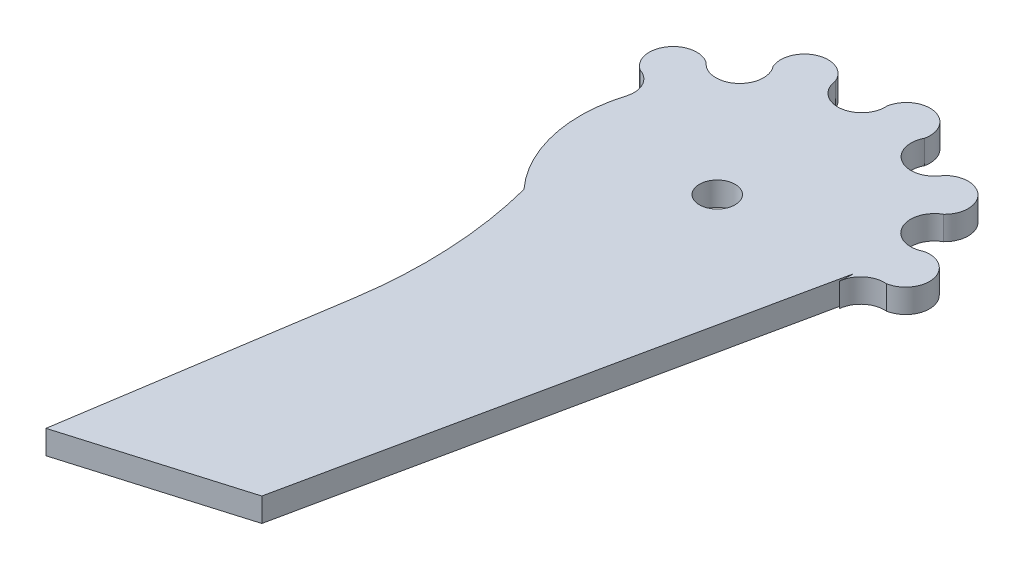
ISO-10303-21;
HEADER;
FILE_DESCRIPTION(('STEP AP214'),'2;1');
FILE_NAME('part.step','',(''),(''),'','','');
FILE_SCHEMA(('AUTOMOTIVE_DESIGN { 1 0 10303 214 1 1 1 1 }'));
ENDSEC;
DATA;
#1=APPLICATION_CONTEXT('core data for automotive mechanical design processes');
#2=APPLICATION_PROTOCOL_DEFINITION('international standard','automotive_design',2000,#1);
#3=PRODUCT_CONTEXT('',#1,'mechanical');
#4=PRODUCT('Part','Part','',(#3));
#5=PRODUCT_RELATED_PRODUCT_CATEGORY('part','',(#4));
#6=PRODUCT_DEFINITION_FORMATION('','',#4);
#7=PRODUCT_DEFINITION_CONTEXT('part definition',#1,'design');
#8=PRODUCT_DEFINITION('design','',#6,#7);
#9=PRODUCT_DEFINITION_SHAPE('','',#8);
#10=(LENGTH_UNIT() NAMED_UNIT(*) SI_UNIT(.MILLI.,.METRE.));
#11=(NAMED_UNIT(*) PLANE_ANGLE_UNIT() SI_UNIT($,.RADIAN.));
#12=(NAMED_UNIT(*) SI_UNIT($,.STERADIAN.) SOLID_ANGLE_UNIT());
#13=UNCERTAINTY_MEASURE_WITH_UNIT(LENGTH_MEASURE(1.E-05),#10,'distance_accuracy_value','');
#14=(GEOMETRIC_REPRESENTATION_CONTEXT(3) GLOBAL_UNCERTAINTY_ASSIGNED_CONTEXT((#13)) GLOBAL_UNIT_ASSIGNED_CONTEXT((#10,
#11,#12)) REPRESENTATION_CONTEXT('',''));
#15=CARTESIAN_POINT('',(0.,0.,0.));
#16=DIRECTION('',(0.,0.,1.));
#17=DIRECTION('',(1.,0.,0.));
#18=AXIS2_PLACEMENT_3D('',#15,#16,#17);
#19=CARTESIAN_POINT('',(11.0072870376266,1.,2.32882652939261));
#20=DIRECTION('',(0.978343188546959,0.,0.20698938480939));
#21=DIRECTION('',(0.20698938480939,0.,-0.978343188546959));
#22=AXIS2_PLACEMENT_3D('',#19,#20,#21);
#23=PLANE('',#22);
#24=DIRECTION('',(-0.20698938480939,0.,0.978343188546959));
#25=VECTOR('',#24,1.);
#26=CARTESIAN_POINT('',(11.0072870376266,-1.,2.32882652939261));
#27=LINE('',#26,#25);
#28=CARTESIAN_POINT('',(11.5,-1.,0.));
#29=VERTEX_POINT('',#28);
#30=CARTESIAN_POINT('',(2.8068078260398,-1.,41.0887029687808));
#31=VERTEX_POINT('',#30);
#32=EDGE_CURVE('E231',#29,#31,#27,.T.);
#33=ORIENTED_EDGE('',*,*,#32,.F.);
#34=DIRECTION('',(0.,-1.,0.));
#35=VECTOR('',#34,1.);
#36=CARTESIAN_POINT('',(11.5,1.,0.));
#37=LINE('',#36,#35);
#38=CARTESIAN_POINT('',(11.5,1.,0.));
#39=VERTEX_POINT('',#38);
#40=EDGE_CURVE('E11',#39,#29,#37,.T.);
#41=ORIENTED_EDGE('',*,*,#40,.F.);
#42=DIRECTION('',(-0.20698938480939,0.,0.978343188546959));
#43=VECTOR('',#42,1.);
#44=CARTESIAN_POINT('',(11.0072870376266,1.,2.32882652939261));
#45=LINE('',#44,#43);
#46=CARTESIAN_POINT('',(2.8068078260398,1.,41.0887029687808));
#47=VERTEX_POINT('',#46);
#48=EDGE_CURVE('E194',#39,#47,#45,.T.);
#49=ORIENTED_EDGE('',*,*,#48,.T.);
#50=DIRECTION('',(0.,-1.,0.));
#51=VECTOR('',#50,1.);
#52=CARTESIAN_POINT('',(2.8068078260398,1.,41.0887029687808));
#53=LINE('',#52,#51);
#54=EDGE_CURVE('E187',#47,#31,#53,.T.);
#55=ORIENTED_EDGE('',*,*,#54,.T.);
#56=EDGE_LOOP('',(#33,#41,#49,#55));
#57=FACE_BOUND('',#56,.T.);
#58=ADVANCED_FACE('F35',(#57),#23,.T.);
#59=CARTESIAN_POINT('',(0.,1.,0.));
#60=DIRECTION('',(0.,-1.,0.));
#61=DIRECTION('',(0.,0.,-1.));
#62=AXIS2_PLACEMENT_3D('',#59,#60,#61);
#63=CYLINDRICAL_SURFACE('',#62,11.5);
#64=CARTESIAN_POINT('',(0.,-1.,0.));
#65=DIRECTION('',(0.,1.,0.));
#66=DIRECTION('',(0.,0.,1.));
#67=AXIS2_PLACEMENT_3D('',#64,#65,#66);
#68=CIRCLE('',#67,11.5);
#69=CARTESIAN_POINT('',(11.4406165211658,-1.,1.16717334429321));
#70=VERTEX_POINT('',#69);
#71=EDGE_CURVE('E233',#70,#29,#68,.T.);
#72=ORIENTED_EDGE('',*,*,#71,.F.);
#73=DIRECTION('',(0.,-1.,0.));
#74=VECTOR('',#73,1.);
#75=CARTESIAN_POINT('',(11.4406165211658,1.,1.16717334429321));
#76=LINE('',#75,#74);
#77=CARTESIAN_POINT('',(11.4406165211658,1.,1.16717334429321));
#78=VERTEX_POINT('',#77);
#79=EDGE_CURVE('E43',#78,#70,#76,.T.);
#80=ORIENTED_EDGE('',*,*,#79,.F.);
#81=CARTESIAN_POINT('',(0.,1.,0.));
#82=DIRECTION('',(0.,1.,0.));
#83=DIRECTION('',(0.,0.,1.));
#84=AXIS2_PLACEMENT_3D('',#81,#82,#83);
#85=CIRCLE('',#84,11.5);
#86=EDGE_CURVE('E196',#78,#39,#85,.T.);
#87=ORIENTED_EDGE('',*,*,#86,.T.);
#88=ORIENTED_EDGE('',*,*,#40,.T.);
#89=EDGE_LOOP('',(#72,#80,#87,#88));
#90=FACE_BOUND('',#89,.T.);
#91=ADVANCED_FACE('F297',(#90),#63,.F.);
#92=CARTESIAN_POINT('',(13.4302889596294,1.,1.37016001286595));
#93=DIRECTION('',(0.,-1.,0.));
#94=DIRECTION('',(0.,0.,-1.));
#95=AXIS2_PLACEMENT_3D('',#92,#93,#94);
#96=CYLINDRICAL_SURFACE('',#95,2.);
#97=CARTESIAN_POINT('',(13.4302889596294,-1.,1.37016001286595));
#98=DIRECTION('',(0.,1.,0.));
#99=DIRECTION('',(0.,0.,1.));
#100=AXIS2_PLACEMENT_3D('',#97,#98,#99);
#101=CIRCLE('',#100,2.);
#102=CARTESIAN_POINT('',(13.5996722350646,-1.,-0.622654405488866));
#103=VERTEX_POINT('',#102);
#104=EDGE_CURVE('E236',#103,#70,#101,.T.);
#105=ORIENTED_EDGE('',*,*,#104,.F.);
#106=DIRECTION('',(0.,-1.,0.));
#107=VECTOR('',#106,1.);
#108=CARTESIAN_POINT('',(13.5996722350646,1.,-0.622654405488866));
#109=LINE('',#108,#107);
#110=CARTESIAN_POINT('',(13.5996722350646,1.,-0.622654405488866));
#111=VERTEX_POINT('',#110);
#112=EDGE_CURVE('E289',#111,#103,#109,.T.);
#113=ORIENTED_EDGE('',*,*,#112,.F.);
#114=CARTESIAN_POINT('',(13.4302889596294,1.,1.37016001286595));
#115=DIRECTION('',(0.,1.,0.));
#116=DIRECTION('',(0.,0.,1.));
#117=AXIS2_PLACEMENT_3D('',#114,#115,#116);
#118=CIRCLE('',#117,2.);
#119=EDGE_CURVE('E199',#111,#78,#118,.T.);
#120=ORIENTED_EDGE('',*,*,#119,.T.);
#121=ORIENTED_EDGE('',*,*,#79,.T.);
#122=EDGE_LOOP('',(#105,#113,#120,#121));
#123=FACE_BOUND('',#122,.T.);
#124=ADVANCED_FACE('F293',(#123),#96,.F.);
#125=CARTESIAN_POINT('',(13.2488992369675,1.,-2.591653720828));
#126=DIRECTION('',(0.,-1.,0.));
#127=DIRECTION('',(0.,0.,-1.));
#128=AXIS2_PLACEMENT_3D('',#125,#126,#127);
#129=CYLINDRICAL_SURFACE('',#128,2.);
#130=CARTESIAN_POINT('',(13.2488992369675,-1.,-2.591653720828));
#131=DIRECTION('',(0.,1.,0.));
#132=DIRECTION('',(0.,0.,1.));
#133=AXIS2_PLACEMENT_3D('',#130,#131,#132);
#134=CIRCLE('',#133,2.);
#135=CARTESIAN_POINT('',(12.8318841714587,-1.,-4.547695242662));
#136=VERTEX_POINT('',#135);
#137=EDGE_CURVE('E239',#103,#136,#134,.T.);
#138=ORIENTED_EDGE('',*,*,#137,.T.);
#139=DIRECTION('',(0.,-1.,0.));
#140=VECTOR('',#139,1.);
#141=CARTESIAN_POINT('',(12.8318841714587,1.,-4.547695242662));
#142=LINE('',#141,#140);
#143=CARTESIAN_POINT('',(12.8318841714587,1.,-4.547695242662));
#144=VERTEX_POINT('',#143);
#145=EDGE_CURVE('E287',#144,#136,#142,.T.);
#146=ORIENTED_EDGE('',*,*,#145,.F.);
#147=CARTESIAN_POINT('',(13.2488992369675,1.,-2.591653720828));
#148=DIRECTION('',(0.,1.,0.));
#149=DIRECTION('',(0.,0.,1.));
#150=AXIS2_PLACEMENT_3D('',#147,#148,#149);
#151=CIRCLE('',#150,2.);
#152=EDGE_CURVE('E202',#111,#144,#151,.T.);
#153=ORIENTED_EDGE('',*,*,#152,.F.);
#154=ORIENTED_EDGE('',*,*,#112,.T.);
#155=EDGE_LOOP('',(#138,#146,#153,#154));
#156=FACE_BOUND('',#155,.T.);
#157=ADVANCED_FACE('F306',(#156),#129,.T.);
#158=CARTESIAN_POINT('',(11.924078965007,1.,-6.3297978511386));
#159=DIRECTION('',(0.,-1.,0.));
#160=DIRECTION('',(0.,0.,-1.));
#161=AXIS2_PLACEMENT_3D('',#158,#159,#160);
#162=CYLINDRICAL_SURFACE('',#161,2.);
#163=CARTESIAN_POINT('',(11.924078965007,-1.,-6.3297978511386));
#164=DIRECTION('',(0.,1.,0.));
#165=DIRECTION('',(0.,0.,1.));
#166=AXIS2_PLACEMENT_3D('',#163,#164,#165);
#167=CIRCLE('',#166,2.);
#168=CARTESIAN_POINT('',(10.9566555496388,-1.,-8.08025263073085));
#169=VERTEX_POINT('',#168);
#170=EDGE_CURVE('E242',#169,#136,#167,.T.);
#171=ORIENTED_EDGE('',*,*,#170,.F.);
#172=DIRECTION('',(0.,-1.,0.));
#173=VECTOR('',#172,1.);
#174=CARTESIAN_POINT('',(10.9566555496388,1.,-8.08025263073085));
#175=LINE('',#174,#173);
#176=CARTESIAN_POINT('',(10.9566555496388,1.,-8.08025263073085));
#177=VERTEX_POINT('',#176);
#178=EDGE_CURVE('E285',#177,#169,#175,.T.);
#179=ORIENTED_EDGE('',*,*,#178,.F.);
#180=CARTESIAN_POINT('',(11.924078965007,1.,-6.3297978511386));
#181=DIRECTION('',(0.,1.,0.));
#182=DIRECTION('',(0.,0.,1.));
#183=AXIS2_PLACEMENT_3D('',#180,#181,#182);
#184=CIRCLE('',#183,2.);
#185=EDGE_CURVE('E204',#177,#144,#184,.T.);
#186=ORIENTED_EDGE('',*,*,#185,.T.);
#187=ORIENTED_EDGE('',*,*,#145,.T.);
#188=EDGE_LOOP('',(#171,#179,#186,#187));
#189=FACE_BOUND('',#188,.T.);
#190=ADVANCED_FACE('F349',(#189),#162,.F.);
#191=CARTESIAN_POINT('',(9.57016518746702,1.,-9.52165627843153));
#192=DIRECTION('',(0.,-1.,0.));
#193=DIRECTION('',(0.,0.,-1.));
#194=AXIS2_PLACEMENT_3D('',#191,#192,#193);
#195=CYLINDRICAL_SURFACE('',#194,2.);
#196=CARTESIAN_POINT('',(9.57016518746702,-1.,-9.52165627843153));
#197=DIRECTION('',(0.,1.,0.));
#198=DIRECTION('',(0.,0.,1.));
#199=AXIS2_PLACEMENT_3D('',#196,#197,#198);
#200=CIRCLE('',#199,2.);
#201=CARTESIAN_POINT('',(8.13582575374972,-1.,-10.9154533902393));
#202=VERTEX_POINT('',#201);
#203=EDGE_CURVE('E245',#169,#202,#200,.T.);
#204=ORIENTED_EDGE('',*,*,#203,.T.);
#205=DIRECTION('',(0.,-1.,0.));
#206=VECTOR('',#205,1.);
#207=CARTESIAN_POINT('',(8.13582575374972,1.,-10.9154533902393));
#208=LINE('',#207,#206);
#209=CARTESIAN_POINT('',(8.13582575374972,1.,-10.9154533902393));
#210=VERTEX_POINT('',#209);
#211=EDGE_CURVE('E283',#210,#202,#208,.T.);
#212=ORIENTED_EDGE('',*,*,#211,.F.);
#213=CARTESIAN_POINT('',(9.57016518746702,1.,-9.52165627843153));
#214=DIRECTION('',(0.,1.,0.));
#215=DIRECTION('',(0.,0.,1.));
#216=AXIS2_PLACEMENT_3D('',#213,#214,#215);
#217=CIRCLE('',#216,2.);
#218=EDGE_CURVE('E207',#177,#210,#217,.T.);
#219=ORIENTED_EDGE('',*,*,#218,.F.);
#220=ORIENTED_EDGE('',*,*,#178,.T.);
#221=EDGE_LOOP('',(#204,#212,#219,#220));
#222=FACE_BOUND('',#221,.T.);
#223=ADVANCED_FACE('F347',(#222),#195,.T.);
#224=CARTESIAN_POINT('',(6.39030964363667,1.,-11.8917594433475));
#225=DIRECTION('',(0.,-1.,0.));
#226=DIRECTION('',(0.,0.,-1.));
#227=AXIS2_PLACEMENT_3D('',#224,#225,#226);
#228=CYLINDRICAL_SURFACE('',#227,2.);
#229=CARTESIAN_POINT('',(6.39030964363667,-1.,-11.8917594433475));
#230=DIRECTION('',(0.,1.,0.));
#231=DIRECTION('',(0.,0.,1.));
#232=AXIS2_PLACEMENT_3D('',#229,#230,#231);
#233=CIRCLE('',#232,2.);
#234=CARTESIAN_POINT('',(4.61284315676973,-1.,-12.8086088792228));
#235=VERTEX_POINT('',#234);
#236=EDGE_CURVE('E248',#235,#202,#233,.T.);
#237=ORIENTED_EDGE('',*,*,#236,.F.);
#238=DIRECTION('',(0.,-1.,0.));
#239=VECTOR('',#238,1.);
#240=CARTESIAN_POINT('',(4.61284315676973,1.,-12.8086088792228));
#241=LINE('',#240,#239);
#242=CARTESIAN_POINT('',(4.61284315676973,1.,-12.8086088792228));
#243=VERTEX_POINT('',#242);
#244=EDGE_CURVE('E281',#243,#235,#241,.T.);
#245=ORIENTED_EDGE('',*,*,#244,.F.);
#246=CARTESIAN_POINT('',(6.39030964363667,1.,-11.8917594433475));
#247=DIRECTION('',(0.,1.,0.));
#248=DIRECTION('',(0.,0.,1.));
#249=AXIS2_PLACEMENT_3D('',#246,#247,#248);
#250=CIRCLE('',#249,2.);
#251=EDGE_CURVE('E209',#243,#210,#250,.T.);
#252=ORIENTED_EDGE('',*,*,#251,.T.);
#253=ORIENTED_EDGE('',*,*,#211,.T.);
#254=EDGE_LOOP('',(#237,#245,#252,#253));
#255=FACE_BOUND('',#254,.T.);
#256=ADVANCED_FACE('F342',(#255),#228,.F.);
#257=CARTESIAN_POINT('',(2.65894599824085,1.,-13.2355584007037));
#258=DIRECTION('',(0.,-1.,0.));
#259=DIRECTION('',(0.,0.,-1.));
#260=AXIS2_PLACEMENT_3D('',#257,#258,#259);
#261=CYLINDRICAL_SURFACE('',#260,2.);
#262=CARTESIAN_POINT('',(2.65894599824085,-1.,-13.2355584007037));
#263=DIRECTION('',(0.,1.,0.));
#264=DIRECTION('',(0.,0.,1.));
#265=AXIS2_PLACEMENT_3D('',#262,#263,#264);
#266=CIRCLE('',#265,2.);
#267=CARTESIAN_POINT('',(0.691754597155725,-1.,-13.5963325565086));
#268=VERTEX_POINT('',#267);
#269=EDGE_CURVE('E251',#235,#268,#266,.T.);
#270=ORIENTED_EDGE('',*,*,#269,.T.);
#271=DIRECTION('',(0.,-1.,0.));
#272=VECTOR('',#271,1.);
#273=CARTESIAN_POINT('',(0.691754597155725,1.,-13.5963325565086));
#274=LINE('',#273,#272);
#275=CARTESIAN_POINT('',(0.691754597155725,1.,-13.5963325565086));
#276=VERTEX_POINT('',#275);
#277=EDGE_CURVE('E279',#276,#268,#274,.T.);
#278=ORIENTED_EDGE('',*,*,#277,.F.);
#279=CARTESIAN_POINT('',(2.65894599824085,1.,-13.2355584007037));
#280=DIRECTION('',(0.,1.,0.));
#281=DIRECTION('',(0.,0.,1.));
#282=AXIS2_PLACEMENT_3D('',#279,#280,#281);
#283=CIRCLE('',#282,2.);
#284=EDGE_CURVE('E212',#243,#276,#283,.T.);
#285=ORIENTED_EDGE('',*,*,#284,.F.);
#286=ORIENTED_EDGE('',*,*,#244,.T.);
#287=EDGE_LOOP('',(#270,#278,#285,#286));
#288=FACE_BOUND('',#287,.T.);
#289=ADVANCED_FACE('F339',(#288),#261,.T.);
#290=CARTESIAN_POINT('',(-1.30189483080211,1.,-13.4370781738267));
#291=DIRECTION('',(0.,-1.,0.));
#292=DIRECTION('',(0.,0.,-1.));
#293=AXIS2_PLACEMENT_3D('',#290,#291,#292);
#294=CYLINDRICAL_SURFACE('',#293,2.);
#295=CARTESIAN_POINT('',(-1.30189483080211,-1.,-13.4370781738267));
#296=DIRECTION('',(0.,1.,0.));
#297=DIRECTION('',(0.,0.,1.));
#298=AXIS2_PLACEMENT_3D('',#295,#296,#297);
#299=CIRCLE('',#298,2.);
#300=CARTESIAN_POINT('',(-3.28903502326781,-1.,-13.2106408635456));
#301=VERTEX_POINT('',#300);
#302=EDGE_CURVE('E254',#301,#268,#299,.T.);
#303=ORIENTED_EDGE('',*,*,#302,.F.);
#304=DIRECTION('',(0.,-1.,0.));
#305=VECTOR('',#304,1.);
#306=CARTESIAN_POINT('',(-3.28903502326781,1.,-13.2106408635456));
#307=LINE('',#306,#305);
#308=CARTESIAN_POINT('',(-3.28903502326781,1.,-13.2106408635456));
#309=VERTEX_POINT('',#308);
#310=EDGE_CURVE('E277',#309,#301,#307,.T.);
#311=ORIENTED_EDGE('',*,*,#310,.F.);
#312=CARTESIAN_POINT('',(-1.30189483080211,1.,-13.4370781738267));
#313=DIRECTION('',(0.,1.,0.));
#314=DIRECTION('',(0.,0.,1.));
#315=AXIS2_PLACEMENT_3D('',#312,#313,#314);
#316=CIRCLE('',#315,2.);
#317=EDGE_CURVE('E214',#309,#276,#316,.T.);
#318=ORIENTED_EDGE('',*,*,#317,.T.);
#319=ORIENTED_EDGE('',*,*,#277,.T.);
#320=EDGE_LOOP('',(#303,#311,#318,#319));
#321=FACE_BOUND('',#320,.T.);
#322=ADVANCED_FACE('F334',(#321),#294,.F.);
#323=CARTESIAN_POINT('',(-5.15037716915933,1.,-12.478926837489));
#324=DIRECTION('',(0.,-1.,0.));
#325=DIRECTION('',(0.,0.,-1.));
#326=AXIS2_PLACEMENT_3D('',#323,#324,#325);
#327=CYLINDRICAL_SURFACE('',#326,2.);
#328=CARTESIAN_POINT('',(-5.15037716915933,-1.,-12.478926837489));
#329=DIRECTION('',(0.,1.,0.));
#330=DIRECTION('',(0.,0.,1.));
#331=AXIS2_PLACEMENT_3D('',#328,#329,#330);
#332=CIRCLE('',#331,2.);
#333=CARTESIAN_POINT('',(-6.98596837336632,-1.,-11.6848204648676));
#334=VERTEX_POINT('',#333);
#335=EDGE_CURVE('E257',#301,#334,#332,.T.);
#336=ORIENTED_EDGE('',*,*,#335,.T.);
#337=DIRECTION('',(0.,-1.,0.));
#338=VECTOR('',#337,1.);
#339=CARTESIAN_POINT('',(-6.98596837336632,1.,-11.6848204648676));
#340=LINE('',#339,#338);
#341=CARTESIAN_POINT('',(-6.98596837336632,1.,-11.6848204648676));
#342=VERTEX_POINT('',#341);
#343=EDGE_CURVE('E275',#342,#334,#340,.T.);
#344=ORIENTED_EDGE('',*,*,#343,.F.);
#345=CARTESIAN_POINT('',(-5.15037716915933,1.,-12.478926837489));
#346=DIRECTION('',(0.,1.,0.));
#347=DIRECTION('',(0.,0.,1.));
#348=AXIS2_PLACEMENT_3D('',#345,#346,#347);
#349=CIRCLE('',#348,2.);
#350=EDGE_CURVE('E217',#309,#342,#349,.T.);
#351=ORIENTED_EDGE('',*,*,#350,.F.);
#352=ORIENTED_EDGE('',*,*,#310,.T.);
#353=EDGE_LOOP('',(#336,#344,#351,#352));
#354=FACE_BOUND('',#353,.T.);
#355=ADVANCED_FACE('F330',(#354),#327,.T.);
#356=CARTESIAN_POINT('',(-8.5543623088968,1.,-10.443796507407));
#357=DIRECTION('',(0.,-1.,0.));
#358=DIRECTION('',(0.,0.,-1.));
#359=AXIS2_PLACEMENT_3D('',#356,#357,#358);
#360=CYLINDRICAL_SURFACE('',#359,2.);
#361=CARTESIAN_POINT('',(-8.5543623088968,-1.,-10.443796507407));
#362=DIRECTION('',(0.,1.,0.));
#363=DIRECTION('',(0.,0.,1.));
#364=AXIS2_PLACEMENT_3D('',#361,#362,#363);
#365=CIRCLE('',#364,2.);
#366=CARTESIAN_POINT('',(-10.0799860010588,-1.,-9.1505554819542));
#367=VERTEX_POINT('',#366);
#368=EDGE_CURVE('E260',#367,#334,#365,.T.);
#369=ORIENTED_EDGE('',*,*,#368,.F.);
#370=DIRECTION('',(0.,-1.,0.));
#371=VECTOR('',#370,1.);
#372=CARTESIAN_POINT('',(-10.0799860010588,1.,-9.1505554819542));
#373=LINE('',#372,#371);
#374=CARTESIAN_POINT('',(-10.0799860010588,1.,-9.1505554819542));
#375=VERTEX_POINT('',#374);
#376=EDGE_CURVE('E273',#375,#367,#373,.T.);
#377=ORIENTED_EDGE('',*,*,#376,.F.);
#378=CARTESIAN_POINT('',(-8.5543623088968,1.,-10.443796507407));
#379=DIRECTION('',(0.,1.,0.));
#380=DIRECTION('',(0.,0.,1.));
#381=AXIS2_PLACEMENT_3D('',#378,#379,#380);
#382=CIRCLE('',#381,2.);
#383=EDGE_CURVE('E219',#375,#342,#382,.T.);
#384=ORIENTED_EDGE('',*,*,#383,.T.);
#385=ORIENTED_EDGE('',*,*,#343,.T.);
#386=EDGE_LOOP('',(#369,#377,#384,#385));
#387=FACE_BOUND('',#386,.T.);
#388=ADVANCED_FACE('F325',(#387),#360,.F.);
#389=CARTESIAN_POINT('',(-11.2200733460983,1.,-7.50732669518082));
#390=DIRECTION('',(0.,-1.,0.));
#391=DIRECTION('',(0.,0.,-1.));
#392=AXIS2_PLACEMENT_3D('',#389,#390,#391);
#393=CYLINDRICAL_SURFACE('',#392,2.);
#394=CARTESIAN_POINT('',(-11.2200733460983,-1.,-7.50732669518082));
#395=DIRECTION('',(0.,1.,0.));
#396=DIRECTION('',(0.,0.,1.));
#397=AXIS2_PLACEMENT_3D('',#394,#395,#396);
#398=CIRCLE('',#397,2.);
#399=CARTESIAN_POINT('',(-12.3040623812584,-1.,-5.82656265116612));
#400=VERTEX_POINT('',#399);
#401=EDGE_CURVE('E263',#367,#400,#398,.T.);
#402=ORIENTED_EDGE('',*,*,#401,.T.);
#403=DIRECTION('',(0.,-1.,0.));
#404=VECTOR('',#403,1.);
#405=CARTESIAN_POINT('',(-12.3040623812584,1.,-5.82656265116612));
#406=LINE('',#405,#404);
#407=CARTESIAN_POINT('',(-12.3040623812584,1.,-5.82656265116612));
#408=VERTEX_POINT('',#407);
#409=EDGE_CURVE('E271',#408,#400,#406,.T.);
#410=ORIENTED_EDGE('',*,*,#409,.F.);
#411=CARTESIAN_POINT('',(-11.2200733460983,1.,-7.50732669518082));
#412=DIRECTION('',(0.,1.,0.));
#413=DIRECTION('',(0.,0.,1.));
#414=AXIS2_PLACEMENT_3D('',#411,#412,#413);
#415=CIRCLE('',#414,2.);
#416=EDGE_CURVE('E222',#375,#408,#415,.T.);
#417=ORIENTED_EDGE('',*,*,#416,.F.);
#418=ORIENTED_EDGE('',*,*,#376,.T.);
#419=EDGE_LOOP('',(#402,#410,#417,#418));
#420=FACE_BOUND('',#419,.T.);
#421=ADVANCED_FACE('F321',(#420),#393,.T.);
#422=CARTESIAN_POINT('',(-12.9174492484454,1.,-3.9229459483705));
#423=DIRECTION('',(0.,-1.,0.));
#424=DIRECTION('',(0.,0.,-1.));
#425=AXIS2_PLACEMENT_3D('',#422,#423,#424);
#426=CYLINDRICAL_SURFACE('',#425,2.);
#427=CARTESIAN_POINT('',(-12.9174492484454,-1.,-3.9229459483705));
#428=DIRECTION('',(0.,1.,0.));
#429=DIRECTION('',(0.,0.,1.));
#430=AXIS2_PLACEMENT_3D('',#427,#428,#429);
#431=CIRCLE('',#430,2.);
#432=CARTESIAN_POINT('',(-11.0037530634906,-1.,-3.34176877083413));
#433=VERTEX_POINT('',#432);
#434=EDGE_CURVE('E266',#433,#400,#431,.T.);
#435=ORIENTED_EDGE('',*,*,#434,.F.);
#436=DIRECTION('',(0.,-1.,0.));
#437=VECTOR('',#436,1.);
#438=CARTESIAN_POINT('',(-11.0037530634906,1.,-3.34176877083413));
#439=LINE('',#438,#437);
#440=CARTESIAN_POINT('',(-11.0037530634906,1.,-3.34176877083413));
#441=VERTEX_POINT('',#440);
#442=EDGE_CURVE('E228',#441,#433,#439,.T.);
#443=ORIENTED_EDGE('',*,*,#442,.F.);
#444=CARTESIAN_POINT('',(-12.9174492484454,1.,-3.9229459483705));
#445=DIRECTION('',(0.,1.,0.));
#446=DIRECTION('',(0.,0.,1.));
#447=AXIS2_PLACEMENT_3D('',#444,#445,#446);
#448=CIRCLE('',#447,2.);
#449=EDGE_CURVE('E224',#441,#408,#448,.T.);
#450=ORIENTED_EDGE('',*,*,#449,.T.);
#451=ORIENTED_EDGE('',*,*,#409,.T.);
#452=EDGE_LOOP('',(#435,#443,#450,#451));
#453=FACE_BOUND('',#452,.T.);
#454=ADVANCED_FACE('F317',(#453),#426,.F.);
#455=CARTESIAN_POINT('',(0.,1.,0.));
#456=DIRECTION('',(0.,-1.,0.));
#457=DIRECTION('',(0.,0.,-1.));
#458=AXIS2_PLACEMENT_3D('',#455,#456,#457);
#459=CYLINDRICAL_SURFACE('',#458,1.5);
#460=CARTESIAN_POINT('',(0.,1.,0.));
#461=DIRECTION('',(0.,1.,0.));
#462=DIRECTION('',(0.,0.,1.));
#463=AXIS2_PLACEMENT_3D('',#460,#461,#462);
#464=CIRCLE('',#463,1.5);
#465=CARTESIAN_POINT('',(0.,1.,1.5));
#466=VERTEX_POINT('',#465);
#467=EDGE_CURVE('E191',#466,#466,#464,.T.);
#468=ORIENTED_EDGE('',*,*,#467,.T.);
#469=EDGE_LOOP('',(#468));
#470=FACE_BOUND('',#469,.T.);
#471=CARTESIAN_POINT('',(0.,-1.,0.));
#472=DIRECTION('',(0.,1.,0.));
#473=DIRECTION('',(0.,0.,1.));
#474=AXIS2_PLACEMENT_3D('',#471,#472,#473);
#475=CIRCLE('',#474,1.5);
#476=CARTESIAN_POINT('',(0.,-1.,1.5));
#477=VERTEX_POINT('',#476);
#478=EDGE_CURVE('E162',#477,#477,#475,.T.);
#479=ORIENTED_EDGE('',*,*,#478,.F.);
#480=EDGE_LOOP('',(#479));
#481=FACE_BOUND('',#480,.T.);
#482=ADVANCED_FACE('F37',(#470,#481),#459,.F.);
#483=CARTESIAN_POINT('',(0.,1.,0.));
#484=DIRECTION('',(0.,-1.,0.));
#485=DIRECTION('',(0.,0.,-1.));
#486=AXIS2_PLACEMENT_3D('',#483,#484,#485);
#487=CYLINDRICAL_SURFACE('',#486,11.5);
#488=CARTESIAN_POINT('',(0.,-1.,0.));
#489=DIRECTION('',(0.,1.,0.));
#490=DIRECTION('',(0.,0.,1.));
#491=AXIS2_PLACEMENT_3D('',#488,#489,#490);
#492=CIRCLE('',#491,11.5);
#493=CARTESIAN_POINT('',(-8.49582527917278,-1.,7.75054532441226));
#494=VERTEX_POINT('',#493);
#495=EDGE_CURVE('E55',#433,#494,#492,.T.);
#496=ORIENTED_EDGE('',*,*,#495,.T.);
#497=DIRECTION('',(0.,-1.,0.));
#498=VECTOR('',#497,1.);
#499=CARTESIAN_POINT('',(-8.49582527917278,1.,7.75054532441226));
#500=LINE('',#499,#498);
#501=CARTESIAN_POINT('',(-8.49582527917278,1.,7.75054532441226));
#502=VERTEX_POINT('',#501);
#503=EDGE_CURVE('E50',#502,#494,#500,.T.);
#504=ORIENTED_EDGE('',*,*,#503,.F.);
#505=CARTESIAN_POINT('',(0.,1.,0.));
#506=DIRECTION('',(0.,1.,0.));
#507=DIRECTION('',(0.,0.,1.));
#508=AXIS2_PLACEMENT_3D('',#505,#506,#507);
#509=CIRCLE('',#508,11.5);
#510=EDGE_CURVE('E173',#441,#502,#509,.T.);
#511=ORIENTED_EDGE('',*,*,#510,.F.);
#512=ORIENTED_EDGE('',*,*,#442,.T.);
#513=EDGE_LOOP('',(#496,#504,#511,#512));
#514=FACE_BOUND('',#513,.T.);
#515=ADVANCED_FACE('F447',(#514),#487,.T.);
#516=CARTESIAN_POINT('',(0.,1.,0.));
#517=DIRECTION('',(0.,1.,0.));
#518=DIRECTION('',(0.,0.,1.));
#519=AXIS2_PLACEMENT_3D('',#516,#517,#518);
#520=PLANE('',#519);
#521=ORIENTED_EDGE('',*,*,#467,.F.);
#522=EDGE_LOOP('',(#521));
#523=FACE_BOUND('',#522,.T.);
#524=ORIENTED_EDGE('',*,*,#48,.F.);
#525=ORIENTED_EDGE('',*,*,#86,.F.);
#526=ORIENTED_EDGE('',*,*,#119,.F.);
#527=ORIENTED_EDGE('',*,*,#152,.T.);
#528=ORIENTED_EDGE('',*,*,#185,.F.);
#529=ORIENTED_EDGE('',*,*,#218,.T.);
#530=ORIENTED_EDGE('',*,*,#251,.F.);
#531=ORIENTED_EDGE('',*,*,#284,.T.);
#532=ORIENTED_EDGE('',*,*,#317,.F.);
#533=ORIENTED_EDGE('',*,*,#350,.T.);
#534=ORIENTED_EDGE('',*,*,#383,.F.);
#535=ORIENTED_EDGE('',*,*,#416,.T.);
#536=ORIENTED_EDGE('',*,*,#449,.F.);
#537=ORIENTED_EDGE('',*,*,#510,.T.);
#538=CARTESIAN_POINT('',(-44.7626279541001,1.,17.1400149489329));
#539=DIRECTION('',(0.,1.,0.));
#540=DIRECTION('',(0.,0.,1.));
#541=AXIS2_PLACEMENT_3D('',#538,#539,#540);
#542=CIRCLE('',#541,37.4625561873707);
#543=CARTESIAN_POINT('',(-7.73841416795312,1.,22.8540948932104));
#544=VERTEX_POINT('',#543);
#545=EDGE_CURVE('E155',#544,#502,#542,.T.);
#546=ORIENTED_EDGE('',*,*,#545,.F.);
#547=DIRECTION('',(0.152527764408235,0.,-0.988299186018397));
#548=VECTOR('',#547,1.);
#549=CARTESIAN_POINT('',(-4.11328581611447,1.,-0.634818179332554));
#550=LINE('',#549,#548);
#551=CARTESIAN_POINT('',(-11.1920072294931,1.,45.2315500719504));
#552=VERTEX_POINT('',#551);
#553=EDGE_CURVE('E170',#552,#544,#550,.T.);
#554=ORIENTED_EDGE('',*,*,#553,.F.);
#555=DIRECTION('',(-0.958890416765563,0.,0.283776617491937));
#556=VECTOR('',#555,1.);
#557=CARTESIAN_POINT('',(11.406704765437,1.,38.5436262618164));
#558=LINE('',#557,#556);
#559=EDGE_CURVE('E177',#47,#552,#558,.T.);
#560=ORIENTED_EDGE('',*,*,#559,.F.);
#561=EDGE_LOOP('',(#524,#525,#526,#527,#528,#529,#530,#531,#532,#533,#534,#535,#536,#537,#546,
#554,#560));
#562=FACE_BOUND('',#561,.T.);
#563=ADVANCED_FACE('F168',(#523,#562),#520,.T.);
#564=CARTESIAN_POINT('',(0.,-1.,0.));
#565=DIRECTION('',(0.,1.,0.));
#566=DIRECTION('',(0.,0.,1.));
#567=AXIS2_PLACEMENT_3D('',#564,#565,#566);
#568=PLANE('',#567);
#569=ORIENTED_EDGE('',*,*,#478,.T.);
#570=EDGE_LOOP('',(#569));
#571=FACE_BOUND('',#570,.T.);
#572=ORIENTED_EDGE('',*,*,#32,.T.);
#573=DIRECTION('',(-0.958890416765563,0.,0.283776617491937));
#574=VECTOR('',#573,1.);
#575=CARTESIAN_POINT('',(11.406704765437,-1.,38.5436262618164));
#576=LINE('',#575,#574);
#577=CARTESIAN_POINT('',(-11.1920072294931,-1.,45.2315500719504));
#578=VERTEX_POINT('',#577);
#579=EDGE_CURVE('E174',#31,#578,#576,.T.);
#580=ORIENTED_EDGE('',*,*,#579,.T.);
#581=DIRECTION('',(0.152527764408235,0.,-0.988299186018397));
#582=VECTOR('',#581,1.);
#583=CARTESIAN_POINT('',(-4.11328581611447,-1.,-0.634818179332554));
#584=LINE('',#583,#582);
#585=CARTESIAN_POINT('',(-7.73841416795312,-1.,22.8540948932104));
#586=VERTEX_POINT('',#585);
#587=EDGE_CURVE('E182',#578,#586,#584,.T.);
#588=ORIENTED_EDGE('',*,*,#587,.T.);
#589=CARTESIAN_POINT('',(-44.7626279541001,-1.,17.1400149489329));
#590=DIRECTION('',(0.,1.,0.));
#591=DIRECTION('',(0.,0.,1.));
#592=AXIS2_PLACEMENT_3D('',#589,#590,#591);
#593=CIRCLE('',#592,37.4625561873707);
#594=EDGE_CURVE('E157',#586,#494,#593,.T.);
#595=ORIENTED_EDGE('',*,*,#594,.T.);
#596=ORIENTED_EDGE('',*,*,#495,.F.);
#597=ORIENTED_EDGE('',*,*,#434,.T.);
#598=ORIENTED_EDGE('',*,*,#401,.F.);
#599=ORIENTED_EDGE('',*,*,#368,.T.);
#600=ORIENTED_EDGE('',*,*,#335,.F.);
#601=ORIENTED_EDGE('',*,*,#302,.T.);
#602=ORIENTED_EDGE('',*,*,#269,.F.);
#603=ORIENTED_EDGE('',*,*,#236,.T.);
#604=ORIENTED_EDGE('',*,*,#203,.F.);
#605=ORIENTED_EDGE('',*,*,#170,.T.);
#606=ORIENTED_EDGE('',*,*,#137,.F.);
#607=ORIENTED_EDGE('',*,*,#104,.T.);
#608=ORIENTED_EDGE('',*,*,#71,.T.);
#609=EDGE_LOOP('',(#572,#580,#588,#595,#596,#597,#598,#599,#600,#601,#602,#603,#604,#605,#606,
#607,#608));
#610=FACE_BOUND('',#609,.T.);
#611=ADVANCED_FACE('F301',(#571,#610),#568,.F.);
#612=CARTESIAN_POINT('',(-44.7626279541001,1.,17.1400149489329));
#613=DIRECTION('',(0.,-1.,0.));
#614=DIRECTION('',(0.,0.,-1.));
#615=AXIS2_PLACEMENT_3D('',#612,#613,#614);
#616=CYLINDRICAL_SURFACE('',#615,37.4625561873707);
#617=ORIENTED_EDGE('',*,*,#594,.F.);
#618=DIRECTION('',(0.,-1.,0.));
#619=VECTOR('',#618,1.);
#620=CARTESIAN_POINT('',(-7.73841416795312,1.,22.8540948932104));
#621=LINE('',#620,#619);
#622=EDGE_CURVE('E152',#544,#586,#621,.T.);
#623=ORIENTED_EDGE('',*,*,#622,.F.);
#624=ORIENTED_EDGE('',*,*,#545,.T.);
#625=ORIENTED_EDGE('',*,*,#503,.T.);
#626=EDGE_LOOP('',(#617,#623,#624,#625));
#627=FACE_BOUND('',#626,.T.);
#628=ADVANCED_FACE('F154',(#627),#616,.F.);
#629=CARTESIAN_POINT('',(-4.11328581611447,1.,-0.634818179332554));
#630=DIRECTION('',(-0.988299186018397,0.,-0.152527764408235));
#631=DIRECTION('',(-0.152527764408235,0.,0.988299186018397));
#632=AXIS2_PLACEMENT_3D('',#629,#630,#631);
#633=PLANE('',#632);
#634=ORIENTED_EDGE('',*,*,#587,.F.);
#635=DIRECTION('',(0.,-1.,0.));
#636=VECTOR('',#635,1.);
#637=CARTESIAN_POINT('',(-11.1920072294931,1.,45.2315500719504));
#638=LINE('',#637,#636);
#639=EDGE_CURVE('E163',#552,#578,#638,.T.);
#640=ORIENTED_EDGE('',*,*,#639,.F.);
#641=ORIENTED_EDGE('',*,*,#553,.T.);
#642=ORIENTED_EDGE('',*,*,#622,.T.);
#643=EDGE_LOOP('',(#634,#640,#641,#642));
#644=FACE_BOUND('',#643,.T.);
#645=ADVANCED_FACE('F176',(#644),#633,.T.);
#646=CARTESIAN_POINT('',(11.406704765437,1.,38.5436262618164));
#647=DIRECTION('',(0.283776617491937,0.,0.958890416765563));
#648=DIRECTION('',(0.958890416765563,0.,-0.283776617491937));
#649=AXIS2_PLACEMENT_3D('',#646,#647,#648);
#650=PLANE('',#649);
#651=ORIENTED_EDGE('',*,*,#579,.F.);
#652=ORIENTED_EDGE('',*,*,#54,.F.);
#653=ORIENTED_EDGE('',*,*,#559,.T.);
#654=ORIENTED_EDGE('',*,*,#639,.T.);
#655=EDGE_LOOP('',(#651,#652,#653,#654));
#656=FACE_BOUND('',#655,.T.);
#657=ADVANCED_FACE('F313',(#656),#650,.T.);
#658=CLOSED_SHELL('',(#58,#91,#124,#157,#190,#223,#256,#289,#322,#355,#388,#421,#454,#482,#515,
#563,#611,#628,#645,#657));
#659=MANIFOLD_SOLID_BREP('B2',#658);
#660=ADVANCED_BREP_SHAPE_REPRESENTATION('',(#18,#659),#14);
#661=SHAPE_DEFINITION_REPRESENTATION(#9,#660);
ENDSEC;
END-ISO-10303-21;
